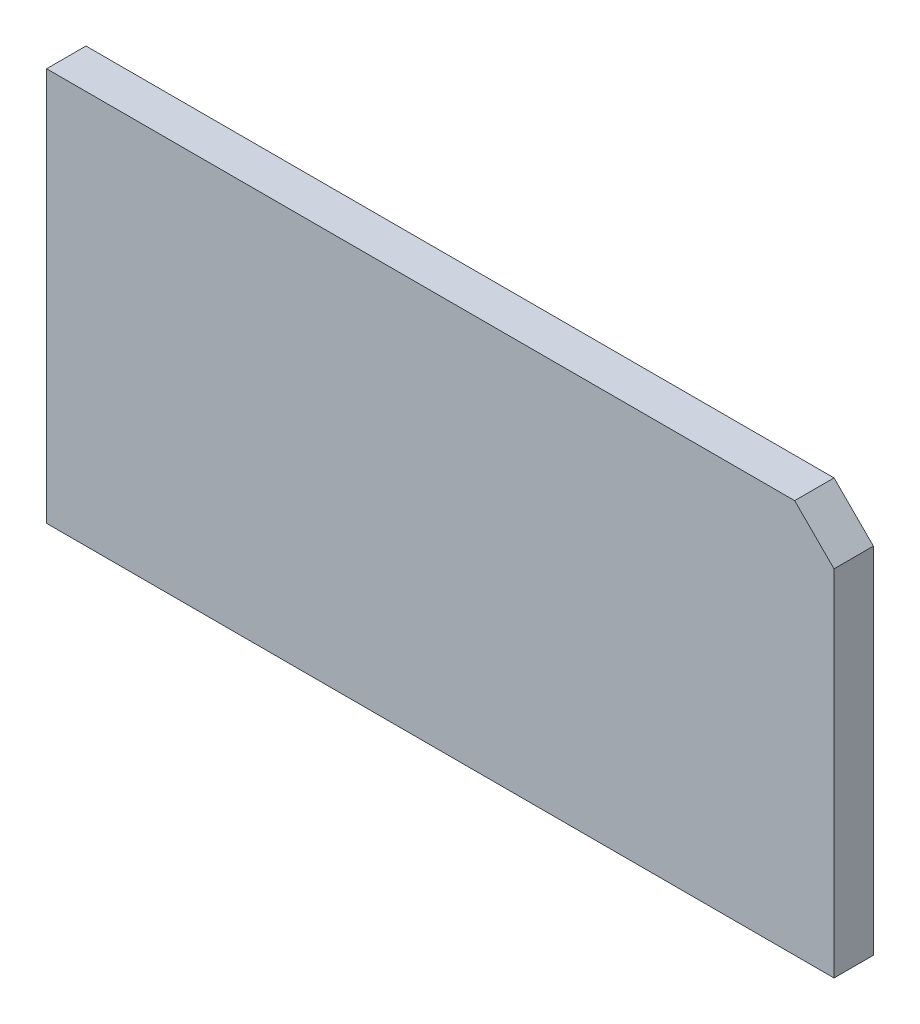
ISO-10303-21;
HEADER;
FILE_DESCRIPTION(('STEP AP214'),'2;1');
FILE_NAME('part.step','',(''),(''),'','','');
FILE_SCHEMA(('AUTOMOTIVE_DESIGN { 1 0 10303 214 1 1 1 1 }'));
ENDSEC;
DATA;
#1=APPLICATION_CONTEXT('core data for automotive mechanical design processes');
#2=APPLICATION_PROTOCOL_DEFINITION('international standard','automotive_design',2000,#1);
#3=PRODUCT_CONTEXT('',#1,'mechanical');
#4=PRODUCT('Part','Part','',(#3));
#5=PRODUCT_RELATED_PRODUCT_CATEGORY('part','',(#4));
#6=PRODUCT_DEFINITION_FORMATION('','',#4);
#7=PRODUCT_DEFINITION_CONTEXT('part definition',#1,'design');
#8=PRODUCT_DEFINITION('design','',#6,#7);
#9=PRODUCT_DEFINITION_SHAPE('','',#8);
#10=(LENGTH_UNIT() NAMED_UNIT(*) SI_UNIT(.MILLI.,.METRE.));
#11=(NAMED_UNIT(*) PLANE_ANGLE_UNIT() SI_UNIT($,.RADIAN.));
#12=(NAMED_UNIT(*) SI_UNIT($,.STERADIAN.) SOLID_ANGLE_UNIT());
#13=UNCERTAINTY_MEASURE_WITH_UNIT(LENGTH_MEASURE(1.E-05),#10,'distance_accuracy_value','');
#14=(GEOMETRIC_REPRESENTATION_CONTEXT(3) GLOBAL_UNCERTAINTY_ASSIGNED_CONTEXT((#13)) GLOBAL_UNIT_ASSIGNED_CONTEXT((#10,
#11,#12)) REPRESENTATION_CONTEXT('',''));
#15=CARTESIAN_POINT('',(0.,0.,0.));
#16=DIRECTION('',(0.,0.,1.));
#17=DIRECTION('',(1.,0.,0.));
#18=AXIS2_PLACEMENT_3D('',#15,#16,#17);
#19=CARTESIAN_POINT('',(-1000.,500.,-100.));
#20=DIRECTION('',(-1.,0.,0.));
#21=DIRECTION('',(0.,-1.,0.));
#22=AXIS2_PLACEMENT_3D('',#19,#20,#21);
#23=PLANE('',#22);
#24=DIRECTION('',(0.,-1.,0.));
#25=VECTOR('',#24,1.);
#26=CARTESIAN_POINT('',(-1000.,500.,0.));
#27=LINE('',#26,#25);
#28=CARTESIAN_POINT('',(-1000.,500.,0.));
#29=VERTEX_POINT('',#28);
#30=CARTESIAN_POINT('',(-1000.,-500.,0.));
#31=VERTEX_POINT('',#30);
#32=EDGE_CURVE('E120',#29,#31,#27,.T.);
#33=ORIENTED_EDGE('',*,*,#32,.F.);
#34=DIRECTION('',(0.,0.,1.));
#35=VECTOR('',#34,1.);
#36=CARTESIAN_POINT('',(-1000.,500.,-100.));
#37=LINE('',#36,#35);
#38=CARTESIAN_POINT('',(-1000.,500.,-100.));
#39=VERTEX_POINT('',#38);
#40=EDGE_CURVE('E11',#39,#29,#37,.T.);
#41=ORIENTED_EDGE('',*,*,#40,.F.);
#42=DIRECTION('',(0.,-1.,0.));
#43=VECTOR('',#42,1.);
#44=CARTESIAN_POINT('',(-1000.,500.,-100.));
#45=LINE('',#44,#43);
#46=CARTESIAN_POINT('',(-1000.,-500.,-100.));
#47=VERTEX_POINT('',#46);
#48=EDGE_CURVE('E118',#39,#47,#45,.T.);
#49=ORIENTED_EDGE('',*,*,#48,.T.);
#50=DIRECTION('',(0.,0.,1.));
#51=VECTOR('',#50,1.);
#52=CARTESIAN_POINT('',(-1000.,-500.,-100.));
#53=LINE('',#52,#51);
#54=EDGE_CURVE('E42',#47,#31,#53,.T.);
#55=ORIENTED_EDGE('',*,*,#54,.T.);
#56=EDGE_LOOP('',(#33,#41,#49,#55));
#57=FACE_BOUND('',#56,.T.);
#58=ADVANCED_FACE('F39',(#57),#23,.T.);
#59=CARTESIAN_POINT('',(-1000.,500.,-100.));
#60=DIRECTION('',(0.,1.,0.));
#61=DIRECTION('',(0.,0.,1.));
#62=AXIS2_PLACEMENT_3D('',#59,#60,#61);
#63=PLANE('',#62);
#64=DIRECTION('',(0.,0.,1.));
#65=VECTOR('',#64,1.);
#66=CARTESIAN_POINT('',(900.,500.,-200.));
#67=LINE('',#66,#65);
#68=CARTESIAN_POINT('',(900.,500.,-100.));
#69=VERTEX_POINT('',#68);
#70=CARTESIAN_POINT('',(900.,500.,0.));
#71=VERTEX_POINT('',#70);
#72=EDGE_CURVE('E56',#69,#71,#67,.T.);
#73=ORIENTED_EDGE('',*,*,#72,.F.);
#74=DIRECTION('',(-1.,0.,0.));
#75=VECTOR('',#74,1.);
#76=CARTESIAN_POINT('',(-1000.,500.,-100.));
#77=LINE('',#76,#75);
#78=EDGE_CURVE('E63',#69,#39,#77,.T.);
#79=ORIENTED_EDGE('',*,*,#78,.T.);
#80=ORIENTED_EDGE('',*,*,#40,.T.);
#81=DIRECTION('',(-1.,0.,0.));
#82=VECTOR('',#81,1.);
#83=CARTESIAN_POINT('',(-1000.,500.,0.));
#84=LINE('',#83,#82);
#85=EDGE_CURVE('E81',#71,#29,#84,.T.);
#86=ORIENTED_EDGE('',*,*,#85,.F.);
#87=EDGE_LOOP('',(#73,#79,#80,#86));
#88=FACE_BOUND('',#87,.T.);
#89=ADVANCED_FACE('F145',(#88),#63,.T.);
#90=CARTESIAN_POINT('',(1000.,500.,-100.));
#91=DIRECTION('',(1.,0.,0.));
#92=DIRECTION('',(0.,1.,0.));
#93=AXIS2_PLACEMENT_3D('',#90,#91,#92);
#94=PLANE('',#93);
#95=DIRECTION('',(0.,0.,1.));
#96=VECTOR('',#95,1.);
#97=CARTESIAN_POINT('',(1000.,400.,-200.));
#98=LINE('',#97,#96);
#99=CARTESIAN_POINT('',(1000.,400.,-100.));
#100=VERTEX_POINT('',#99);
#101=CARTESIAN_POINT('',(1000.,400.,0.));
#102=VERTEX_POINT('',#101);
#103=EDGE_CURVE('E96',#100,#102,#98,.T.);
#104=ORIENTED_EDGE('',*,*,#103,.T.);
#105=DIRECTION('',(0.,1.,0.));
#106=VECTOR('',#105,1.);
#107=CARTESIAN_POINT('',(1000.,500.,0.));
#108=LINE('',#107,#106);
#109=CARTESIAN_POINT('',(1000.,-500.,0.));
#110=VERTEX_POINT('',#109);
#111=EDGE_CURVE('E105',#110,#102,#108,.T.);
#112=ORIENTED_EDGE('',*,*,#111,.F.);
#113=DIRECTION('',(0.,0.,1.));
#114=VECTOR('',#113,1.);
#115=CARTESIAN_POINT('',(1000.,-500.,-100.));
#116=LINE('',#115,#114);
#117=CARTESIAN_POINT('',(1000.,-500.,-100.));
#118=VERTEX_POINT('',#117);
#119=EDGE_CURVE('E48',#118,#110,#116,.T.);
#120=ORIENTED_EDGE('',*,*,#119,.F.);
#121=DIRECTION('',(0.,1.,0.));
#122=VECTOR('',#121,1.);
#123=CARTESIAN_POINT('',(1000.,500.,-100.));
#124=LINE('',#123,#122);
#125=EDGE_CURVE('E108',#118,#100,#124,.T.);
#126=ORIENTED_EDGE('',*,*,#125,.T.);
#127=EDGE_LOOP('',(#104,#112,#120,#126));
#128=FACE_BOUND('',#127,.T.);
#129=ADVANCED_FACE('F104',(#128),#94,.T.);
#130=CARTESIAN_POINT('',(-1000.,-500.,-100.));
#131=DIRECTION('',(0.,-1.,0.));
#132=DIRECTION('',(0.,0.,-1.));
#133=AXIS2_PLACEMENT_3D('',#130,#131,#132);
#134=PLANE('',#133);
#135=DIRECTION('',(1.,0.,0.));
#136=VECTOR('',#135,1.);
#137=CARTESIAN_POINT('',(-1000.,-500.,0.));
#138=LINE('',#137,#136);
#139=EDGE_CURVE('E113',#31,#110,#138,.T.);
#140=ORIENTED_EDGE('',*,*,#139,.F.);
#141=ORIENTED_EDGE('',*,*,#54,.F.);
#142=DIRECTION('',(1.,0.,0.));
#143=VECTOR('',#142,1.);
#144=CARTESIAN_POINT('',(-1000.,-500.,-100.));
#145=LINE('',#144,#143);
#146=EDGE_CURVE('E131',#47,#118,#145,.T.);
#147=ORIENTED_EDGE('',*,*,#146,.T.);
#148=ORIENTED_EDGE('',*,*,#119,.T.);
#149=EDGE_LOOP('',(#140,#141,#147,#148));
#150=FACE_BOUND('',#149,.T.);
#151=ADVANCED_FACE('F142',(#150),#134,.T.);
#152=CARTESIAN_POINT('',(0.,0.,-100.));
#153=DIRECTION('',(0.,0.,1.));
#154=DIRECTION('',(1.,0.,0.));
#155=AXIS2_PLACEMENT_3D('',#152,#153,#154);
#156=PLANE('',#155);
#157=ORIENTED_EDGE('',*,*,#78,.F.);
#158=DIRECTION('',(0.707106781186548,-0.707106781186547,0.));
#159=VECTOR('',#158,1.);
#160=CARTESIAN_POINT('',(699.999999999999,700.,-100.));
#161=LINE('',#160,#159);
#162=EDGE_CURVE('E110',#69,#100,#161,.T.);
#163=ORIENTED_EDGE('',*,*,#162,.T.);
#164=ORIENTED_EDGE('',*,*,#125,.F.);
#165=ORIENTED_EDGE('',*,*,#146,.F.);
#166=ORIENTED_EDGE('',*,*,#48,.F.);
#167=EDGE_LOOP('',(#157,#163,#164,#165,#166));
#168=FACE_BOUND('',#167,.T.);
#169=ADVANCED_FACE('F144',(#168),#156,.F.);
#170=CARTESIAN_POINT('',(0.,0.,0.));
#171=DIRECTION('',(0.,0.,1.));
#172=DIRECTION('',(1.,0.,0.));
#173=AXIS2_PLACEMENT_3D('',#170,#171,#172);
#174=PLANE('',#173);
#175=DIRECTION('',(0.707106781186548,-0.707106781186547,0.));
#176=VECTOR('',#175,1.);
#177=CARTESIAN_POINT('',(900.,500.,0.));
#178=LINE('',#177,#176);
#179=EDGE_CURVE('E93',#71,#102,#178,.T.);
#180=ORIENTED_EDGE('',*,*,#179,.F.);
#181=ORIENTED_EDGE('',*,*,#85,.T.);
#182=ORIENTED_EDGE('',*,*,#32,.T.);
#183=ORIENTED_EDGE('',*,*,#139,.T.);
#184=ORIENTED_EDGE('',*,*,#111,.T.);
#185=EDGE_LOOP('',(#180,#181,#182,#183,#184));
#186=FACE_BOUND('',#185,.T.);
#187=ADVANCED_FACE('F112',(#186),#174,.T.);
#188=CARTESIAN_POINT('',(900.,500.,-200.));
#189=DIRECTION('',(-0.707106781186547,-0.707106781186548,0.));
#190=DIRECTION('',(0.707106781186548,-0.707106781186547,0.));
#191=AXIS2_PLACEMENT_3D('',#188,#189,#190);
#192=PLANE('',#191);
#193=ORIENTED_EDGE('',*,*,#72,.T.);
#194=ORIENTED_EDGE('',*,*,#179,.T.);
#195=ORIENTED_EDGE('',*,*,#103,.F.);
#196=ORIENTED_EDGE('',*,*,#162,.F.);
#197=EDGE_LOOP('',(#193,#194,#195,#196));
#198=FACE_BOUND('',#197,.T.);
#199=ADVANCED_FACE('F95',(#198),#192,.F.);
#200=CLOSED_SHELL('',(#58,#89,#129,#151,#169,#187,#199));
#201=MANIFOLD_SOLID_BREP('B2',#200);
#202=ADVANCED_BREP_SHAPE_REPRESENTATION('',(#18,#201),#14);
#203=SHAPE_DEFINITION_REPRESENTATION(#9,#202);
ENDSEC;
END-ISO-10303-21;
